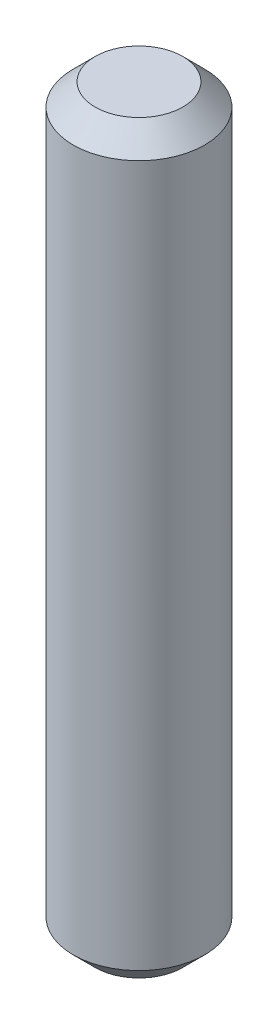
ISO-10303-21;
HEADER;
FILE_DESCRIPTION(('STEP AP214'),'2;1');
FILE_NAME('part.step','',(''),(''),'','','');
FILE_SCHEMA(('AUTOMOTIVE_DESIGN { 1 0 10303 214 1 1 1 1 }'));
ENDSEC;
DATA;
#1=APPLICATION_CONTEXT('core data for automotive mechanical design processes');
#2=APPLICATION_PROTOCOL_DEFINITION('international standard','automotive_design',2000,#1);
#3=PRODUCT_CONTEXT('',#1,'mechanical');
#4=PRODUCT('Part','Part','',(#3));
#5=PRODUCT_RELATED_PRODUCT_CATEGORY('part','',(#4));
#6=PRODUCT_DEFINITION_FORMATION('','',#4);
#7=PRODUCT_DEFINITION_CONTEXT('part definition',#1,'design');
#8=PRODUCT_DEFINITION('design','',#6,#7);
#9=PRODUCT_DEFINITION_SHAPE('','',#8);
#10=(LENGTH_UNIT() NAMED_UNIT(*) SI_UNIT(.MILLI.,.METRE.));
#11=(NAMED_UNIT(*) PLANE_ANGLE_UNIT() SI_UNIT($,.RADIAN.));
#12=(NAMED_UNIT(*) SI_UNIT($,.STERADIAN.) SOLID_ANGLE_UNIT());
#13=UNCERTAINTY_MEASURE_WITH_UNIT(LENGTH_MEASURE(1.E-05),#10,'distance_accuracy_value','');
#14=(GEOMETRIC_REPRESENTATION_CONTEXT(3) GLOBAL_UNCERTAINTY_ASSIGNED_CONTEXT((#13)) GLOBAL_UNIT_ASSIGNED_CONTEXT((#10,
#11,#12)) REPRESENTATION_CONTEXT('',''));
#15=CARTESIAN_POINT('',(0.,0.,0.));
#16=DIRECTION('',(0.,0.,1.));
#17=DIRECTION('',(1.,0.,0.));
#18=AXIS2_PLACEMENT_3D('',#15,#16,#17);
#19=CARTESIAN_POINT('',(0.,33.2907751056608,0.));
#20=DIRECTION('',(0.,-1.,0.));
#21=DIRECTION('',(0.,0.,-1.));
#22=AXIS2_PLACEMENT_3D('',#19,#20,#21);
#23=PLANE('',#22);
#24=CARTESIAN_POINT('',(0.,33.2907751056608,0.));
#25=DIRECTION('',(0.,-1.,0.));
#26=DIRECTION('',(0.,0.,-1.));
#27=AXIS2_PLACEMENT_3D('',#24,#25,#26);
#28=CIRCLE('',#27,3.99999999999999);
#29=CARTESIAN_POINT('',(0.,33.2907751056608,-3.99999999999999));
#30=VERTEX_POINT('',#29);
#31=EDGE_CURVE('E10',#30,#30,#28,.F.);
#32=ORIENTED_EDGE('',*,*,#31,.T.);
#33=EDGE_LOOP('',(#32));
#34=FACE_BOUND('',#33,.T.);
#35=ADVANCED_FACE('F39',(#34),#23,.F.);
#36=CARTESIAN_POINT('',(0.,37.2112522428377,0.));
#37=DIRECTION('',(0.,1.,0.));
#38=DIRECTION('',(0.,0.,1.));
#39=AXIS2_PLACEMENT_3D('',#36,#37,#38);
#40=CYLINDRICAL_SURFACE('',#39,6.00000000000001);
#41=CARTESIAN_POINT('',(0.,-32.7092248943393,0.));
#42=DIRECTION('',(0.,1.,0.));
#43=DIRECTION('',(0.,0.,1.));
#44=AXIS2_PLACEMENT_3D('',#41,#42,#43);
#45=CIRCLE('',#44,6.00000000000001);
#46=CARTESIAN_POINT('',(0.,-32.7092248943393,6.00000000000001));
#47=VERTEX_POINT('',#46);
#48=EDGE_CURVE('E51',#47,#47,#45,.T.);
#49=ORIENTED_EDGE('',*,*,#48,.T.);
#50=EDGE_LOOP('',(#49));
#51=FACE_BOUND('',#50,.T.);
#52=CARTESIAN_POINT('',(0.,31.2907751056607,0.));
#53=DIRECTION('',(0.,-1.,0.));
#54=DIRECTION('',(0.,0.,-1.));
#55=AXIS2_PLACEMENT_3D('',#52,#53,#54);
#56=CIRCLE('',#55,6.00000000000001);
#57=CARTESIAN_POINT('',(0.,31.2907751056607,-6.00000000000001));
#58=VERTEX_POINT('',#57);
#59=EDGE_CURVE('E55',#58,#58,#56,.T.);
#60=ORIENTED_EDGE('',*,*,#59,.T.);
#61=EDGE_LOOP('',(#60));
#62=FACE_BOUND('',#61,.T.);
#63=ADVANCED_FACE('F61',(#51,#62),#40,.T.);
#64=CARTESIAN_POINT('',(6.00000000000001,-34.7092248943392,0.));
#65=DIRECTION('',(0.,1.,0.));
#66=DIRECTION('',(0.,0.,1.));
#67=AXIS2_PLACEMENT_3D('',#64,#65,#66);
#68=PLANE('',#67);
#69=CARTESIAN_POINT('',(0.,-34.7092248943392,0.));
#70=DIRECTION('',(0.,1.,0.));
#71=DIRECTION('',(0.,0.,1.));
#72=AXIS2_PLACEMENT_3D('',#69,#70,#71);
#73=CIRCLE('',#72,4.);
#74=CARTESIAN_POINT('',(0.,-34.7092248943392,4.));
#75=VERTEX_POINT('',#74);
#76=EDGE_CURVE('E47',#75,#75,#73,.F.);
#77=ORIENTED_EDGE('',*,*,#76,.T.);
#78=EDGE_LOOP('',(#77));
#79=FACE_BOUND('',#78,.T.);
#80=ADVANCED_FACE('F69',(#79),#68,.F.);
#81=CARTESIAN_POINT('',(0.,-32.7092248943393,0.));
#82=DIRECTION('',(0.,1.,0.));
#83=DIRECTION('',(0.,0.,1.));
#84=AXIS2_PLACEMENT_3D('',#81,#82,#83);
#85=CONICAL_SURFACE('',#84,6.00000000000001,0.78539816339745);
#86=ORIENTED_EDGE('',*,*,#76,.F.);
#87=EDGE_LOOP('',(#86));
#88=FACE_BOUND('',#87,.T.);
#89=ORIENTED_EDGE('',*,*,#48,.F.);
#90=EDGE_LOOP('',(#89));
#91=FACE_BOUND('',#90,.T.);
#92=ADVANCED_FACE('F65',(#88,#91),#85,.T.);
#93=CARTESIAN_POINT('',(0.,33.2907751056608,0.));
#94=DIRECTION('',(0.,-1.,0.));
#95=DIRECTION('',(0.,0.,-1.));
#96=AXIS2_PLACEMENT_3D('',#93,#94,#95);
#97=CONICAL_SURFACE('',#96,3.99999999999999,0.785398163397445);
#98=ORIENTED_EDGE('',*,*,#59,.F.);
#99=EDGE_LOOP('',(#98));
#100=FACE_BOUND('',#99,.T.);
#101=ORIENTED_EDGE('',*,*,#31,.F.);
#102=EDGE_LOOP('',(#101));
#103=FACE_BOUND('',#102,.T.);
#104=ADVANCED_FACE('F42',(#100,#103),#97,.T.);
#105=CLOSED_SHELL('',(#35,#63,#80,#92,#104));
#106=MANIFOLD_SOLID_BREP('B2',#105);
#107=ADVANCED_BREP_SHAPE_REPRESENTATION('',(#18,#106),#14);
#108=SHAPE_DEFINITION_REPRESENTATION(#9,#107);
ENDSEC;
END-ISO-10303-21;
